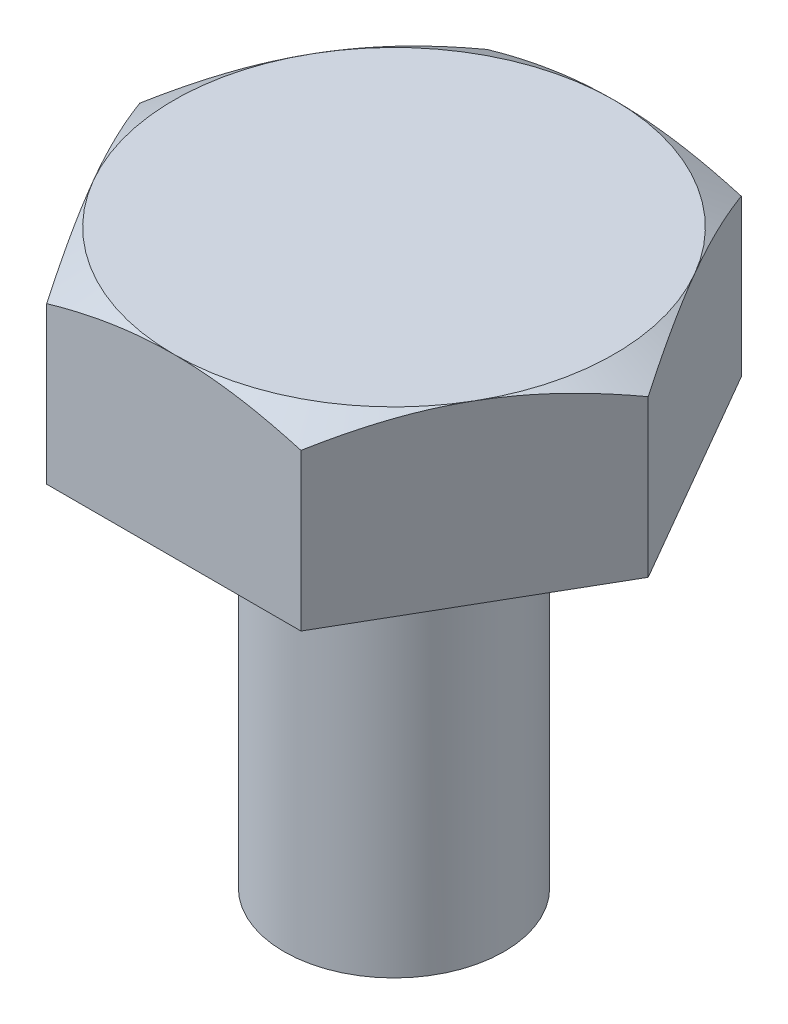
ISO-10303-21;
HEADER;
FILE_DESCRIPTION(('STEP AP214'),'2;1');
FILE_NAME('part.step','',(''),(''),'','','');
FILE_SCHEMA(('AUTOMOTIVE_DESIGN { 1 0 10303 214 1 1 1 1 }'));
ENDSEC;
DATA;
#1=APPLICATION_CONTEXT('core data for automotive mechanical design processes');
#2=APPLICATION_PROTOCOL_DEFINITION('international standard','automotive_design',2000,#1);
#3=PRODUCT_CONTEXT('',#1,'mechanical');
#4=PRODUCT('Part','Part','',(#3));
#5=PRODUCT_RELATED_PRODUCT_CATEGORY('part','',(#4));
#6=PRODUCT_DEFINITION_FORMATION('','',#4);
#7=PRODUCT_DEFINITION_CONTEXT('part definition',#1,'design');
#8=PRODUCT_DEFINITION('design','',#6,#7);
#9=PRODUCT_DEFINITION_SHAPE('','',#8);
#10=(LENGTH_UNIT() NAMED_UNIT(*) SI_UNIT(.MILLI.,.METRE.));
#11=(NAMED_UNIT(*) PLANE_ANGLE_UNIT() SI_UNIT($,.RADIAN.));
#12=(NAMED_UNIT(*) SI_UNIT($,.STERADIAN.) SOLID_ANGLE_UNIT());
#13=UNCERTAINTY_MEASURE_WITH_UNIT(LENGTH_MEASURE(1.E-05),#10,'distance_accuracy_value','');
#14=(GEOMETRIC_REPRESENTATION_CONTEXT(3) GLOBAL_UNCERTAINTY_ASSIGNED_CONTEXT((#13)) GLOBAL_UNIT_ASSIGNED_CONTEXT((#10,
#11,#12)) REPRESENTATION_CONTEXT('',''));
#15=CARTESIAN_POINT('',(0.,0.,0.));
#16=DIRECTION('',(0.,0.,1.));
#17=DIRECTION('',(1.,0.,0.));
#18=AXIS2_PLACEMENT_3D('',#15,#16,#17);
#19=CARTESIAN_POINT('',(2.88675134594818,-4.,4.99999999999995));
#20=DIRECTION('',(0.866025403784442,0.,0.499999999999995));
#21=DIRECTION('',(0.499999999999995,0.,-0.866025403784442));
#22=AXIS2_PLACEMENT_3D('',#19,#20,#21);
#23=PLANE('',#22);
#24=DIRECTION('',(0.,1.,0.));
#25=VECTOR('',#24,1.);
#26=CARTESIAN_POINT('',(5.77350269189624,-4.,0.));
#27=LINE('',#26,#25);
#28=CARTESIAN_POINT('',(5.77350269189624,-4.,0.));
#29=VERTEX_POINT('',#28);
#30=CARTESIAN_POINT('',(5.77350269189624,-0.446580567773385,0.));
#31=VERTEX_POINT('',#30);
#32=EDGE_CURVE('E141',#29,#31,#27,.T.);
#33=ORIENTED_EDGE('',*,*,#32,.T.);
#34=CARTESIAN_POINT('',(5.77361816195007,-0.446647236440011,-0.000200000000000014));
#35=CARTESIAN_POINT('',(5.64675433465069,-0.373385148025819,0.219534594525185));
#36=CARTESIAN_POINT('',(5.51880543790588,-0.306749902306278,0.441148584459581));
#37=CARTESIAN_POINT('',(5.26069210252316,-0.190437571399,0.888213995453513));
#38=CARTESIAN_POINT('',(5.1305230779472,-0.14080163030398,1.11367335959077));
#39=CARTESIAN_POINT('',(4.8717783900464,-0.0635496058068919,1.56183230522351));
#40=CARTESIAN_POINT('',(4.74324302208386,-0.0354189586716842,1.78446209310419));
#41=CARTESIAN_POINT('',(4.54998783160116,-0.010193502341881,2.11918990184664));
#42=CARTESIAN_POINT('',(4.48552534905128,-0.00461204015768112,2.23084219680506));
#43=CARTESIAN_POINT('',(4.35654081066911,0.000799202860331559,2.4542499706738));
#44=CARTESIAN_POINT('',(4.2920187567385,0.000629161353597956,2.56600544629031));
#45=CARTESIAN_POINT('',(4.11524635305245,-0.00775221218023627,2.87218423085063));
#46=CARTESIAN_POINT('',(4.00305457769147,-0.0218283522854515,3.0665060859672));
#47=CARTESIAN_POINT('',(3.77941563226459,-0.0664638374976299,3.45386010199769));
#48=CARTESIAN_POINT('',(3.6679692482842,-0.097038440535706,3.64689090137155));
#49=CARTESIAN_POINT('',(3.44387972423147,-0.173467074009359,4.03502534247482));
#50=CARTESIAN_POINT('',(3.33126486598683,-0.219644959266873,4.2300799986417));
#51=CARTESIAN_POINT('',(3.10771464157944,-0.324450374880123,4.61728034535872));
#52=CARTESIAN_POINT('',(2.99677641204851,-0.38305328382556,4.80943099540804));
#53=CARTESIAN_POINT('',(2.88663587589434,-0.446647236440012,5.00019999999995));
#54=B_SPLINE_CURVE_WITH_KNOTS('',3,(#34,#35,#36,#37,#38,#39,#40,#41,#42,#43,#44,#45,#46,#47,#48,
#49,#50,#51,#52,#53),.UNSPECIFIED.,.F.,.F.,(4,2,2,2,2,2,2,2,2,4),(0.,0.792555841363087,
1.58701660053333,2.36181537487279,2.74884076077324,3.13585419177293,3.80962362599676,
4.48401723901184,5.17336882348922,5.86136694793717),.UNSPECIFIED.);
#55=CARTESIAN_POINT('',(4.33012914833991,0.,2.50000122941986));
#56=VERTEX_POINT('',#55);
#57=EDGE_CURVE('E56',#31,#56,#54,.T.);
#58=ORIENTED_EDGE('',*,*,#57,.T.);
#59=CARTESIAN_POINT('',(2.88675134594817,-0.446580567773385,4.99999999999995));
#60=VERTEX_POINT('',#59);
#61=EDGE_CURVE('E106',#56,#60,#54,.T.);
#62=ORIENTED_EDGE('',*,*,#61,.T.);
#63=DIRECTION('',(0.,1.,0.));
#64=VECTOR('',#63,1.);
#65=CARTESIAN_POINT('',(2.88675134594818,-4.,4.99999999999995));
#66=LINE('',#65,#64);
#67=CARTESIAN_POINT('',(2.88675134594818,-4.,4.99999999999995));
#68=VERTEX_POINT('',#67);
#69=EDGE_CURVE('E115',#68,#60,#66,.T.);
#70=ORIENTED_EDGE('',*,*,#69,.F.);
#71=DIRECTION('',(0.499999999999995,0.,-0.866025403784442));
#72=VECTOR('',#71,1.);
#73=CARTESIAN_POINT('',(2.88675134594818,-4.,4.99999999999995));
#74=LINE('',#73,#72);
#75=EDGE_CURVE('E156',#68,#29,#74,.T.);
#76=ORIENTED_EDGE('',*,*,#75,.T.);
#77=EDGE_LOOP('',(#33,#58,#62,#70,#76));
#78=FACE_BOUND('',#77,.T.);
#79=ADVANCED_FACE('F33',(#78),#23,.T.);
#80=CARTESIAN_POINT('',(-2.88675134594807,-4.,5.00000000000001));
#81=DIRECTION('',(0.,0.,1.));
#82=DIRECTION('',(1.,0.,0.));
#83=AXIS2_PLACEMENT_3D('',#80,#81,#82);
#84=PLANE('',#83);
#85=ORIENTED_EDGE('',*,*,#69,.T.);
#86=CARTESIAN_POINT('',(-7.65609018435094,-2.39263220212063,5.00000000000006));
#87=CARTESIAN_POINT('',(-7.43656190937069,-2.28654401218329,5.00000000000006));
#88=CARTESIAN_POINT('',(-7.21651459555466,-2.1815104270237,5.00000000000005));
#89=CARTESIAN_POINT('',(-6.7751012500889,-1.97415510272064,5.00000000000005));
#90=CARTESIAN_POINT('',(-6.55373499813813,-1.8718338331031,5.00000000000005));
#91=CARTESIAN_POINT('',(-6.10820733372779,-1.66996674232914,5.00000000000004));
#92=CARTESIAN_POINT('',(-5.88403717501922,-1.57044015476935,5.00000000000004));
#93=CARTESIAN_POINT('',(-5.43385436348423,-1.3756618908499,5.00000000000003));
#94=CARTESIAN_POINT('',(-5.20784180742595,-1.28040999165875,5.00000000000003));
#95=CARTESIAN_POINT('',(-4.75080902593032,-1.09418696044532,5.00000000000003));
#96=CARTESIAN_POINT('',(-4.51976138696337,-1.00328273956002,5.00000000000002));
#97=CARTESIAN_POINT('',(-4.05494070596534,-0.828593945863442,5.00000000000002));
#98=CARTESIAN_POINT('',(-3.82116736399506,-0.744810165163836,5.00000000000002));
#99=CARTESIAN_POINT('',(-3.3510043325748,-0.586613265985593,5.00000000000001));
#100=CARTESIAN_POINT('',(-3.11462141422778,-0.512180225528789,5.00000000000001));
#101=CARTESIAN_POINT('',(-2.63849263778652,-0.375103017176557,5.00000000000001));
#102=CARTESIAN_POINT('',(-2.39874786903994,-0.312455121219565,5.));
#103=CARTESIAN_POINT('',(-1.91574318982232,-0.201986365962789,5.));
#104=CARTESIAN_POINT('',(-1.67248236141111,-0.154169454542874,5.));
#105=CARTESIAN_POINT('',(-1.18299374299526,-0.0765941556154826,4.99999999999999));
#106=CARTESIAN_POINT('',(-0.93676595036768,-0.0468357840738073,4.99999999999999));
#107=CARTESIAN_POINT('',(-0.567032419424467,-0.0176497910831011,4.99999999999998));
#108=CARTESIAN_POINT('',(-0.444105436588524,-0.0104949065327889,4.99999999999998));
#109=CARTESIAN_POINT('',(-0.198053141742521,-0.00139403576330962,4.99999999999998));
#110=CARTESIAN_POINT('',(-0.0749278323287925,0.000552018099978425,4.99999999999998));
#111=CARTESIAN_POINT('',(0.171257867231158,-0.000817048092456717,4.99999999999998));
#112=CARTESIAN_POINT('',(0.294318265897848,-0.00413069022137298,4.99999999999998));
#113=CARTESIAN_POINT('',(0.540192602192616,-0.0159351696708046,4.99999999999997));
#114=CARTESIAN_POINT('',(0.663006527068324,-0.0244262682762967,4.99999999999997));
#115=CARTESIAN_POINT('',(0.960681742759001,-0.0511049465513444,4.99999999999997));
#116=CARTESIAN_POINT('',(1.13531422840853,-0.0718875309514342,4.99999999999997));
#117=CARTESIAN_POINT('',(1.48321661523302,-0.122764212712431,4.99999999999996));
#118=CARTESIAN_POINT('',(1.65648633154974,-0.152859551739061,4.99999999999996));
#119=CARTESIAN_POINT('',(2.00155410564534,-0.221297339178058,4.99999999999996));
#120=CARTESIAN_POINT('',(2.17335051478505,-0.259648021310516,4.99999999999995));
#121=CARTESIAN_POINT('',(2.51518151544091,-0.343426842513885,4.99999999999995));
#122=CARTESIAN_POINT('',(2.68521621354955,-0.388854550690059,4.99999999999995));
#123=CARTESIAN_POINT('',(3.02770301117754,-0.486886309173089,4.99999999999995));
#124=CARTESIAN_POINT('',(3.20011230264631,-0.539638887650472,4.99999999999994));
#125=CARTESIAN_POINT('',(3.54310851544624,-0.650356304639038,4.99999999999994));
#126=CARTESIAN_POINT('',(3.71369660418826,-0.708317548045724,4.99999999999994));
#127=CARTESIAN_POINT('',(4.0523659032244,-0.828255048596891,4.99999999999994));
#128=CARTESIAN_POINT('',(4.2204558193518,-0.890206870222438,4.99999999999993));
#129=CARTESIAN_POINT('',(4.55533150693029,-1.01774673287997,4.99999999999993));
#130=CARTESIAN_POINT('',(4.72211671976801,-1.08333624354761,4.99999999999993));
#131=CARTESIAN_POINT('',(4.88829602037971,-1.15038475100049,4.99999999999993));
#132=B_SPLINE_CURVE_WITH_KNOTS('',3,(#86,#87,#88,#89,#90,#91,#92,#93,#94,#95,#96,#97,#98,#99,
#100,#101,#102,#103,#104,#105,#106,#107,#108,#109,#110,#111,#112,#113,#114,#115,#116,#117,#118,
#119,#120,#121,#122,#123,#124,#125,#126,#127,#128,#129,#130,#131),.UNSPECIFIED.,.F.,.F.,(4,2,2,
2,2,2,2,2,2,2,2,2,2,2,2,2,2,2,2,2,2,2,4),(0.,0.731464746840386,1.46305530058782,
2.19883245126867,2.9345712026118,3.67934254544627,4.424196632036,5.16743585966691,
5.91043957739487,6.65364090688248,7.39684289344359,7.76615422427022,8.13546075903743,
8.50466354039125,8.87388495543627,9.4011855081749,9.92855639599253,10.4564557308474,
10.984322936358,11.5251203048538,12.065547231906,12.602932273231,13.140536023766),.UNSPECIFIED.);
#133=CARTESIAN_POINT('',(0.,0.,5.00000245883977));
#134=VERTEX_POINT('',#133);
#135=EDGE_CURVE('E103',#60,#134,#132,.F.);
#136=ORIENTED_EDGE('',*,*,#135,.T.);
#137=CARTESIAN_POINT('',(-2.88675134594807,-0.446580567773385,5.00000000000001));
#138=VERTEX_POINT('',#137);
#139=EDGE_CURVE('E110',#134,#138,#132,.F.);
#140=ORIENTED_EDGE('',*,*,#139,.T.);
#141=DIRECTION('',(0.,1.,0.));
#142=VECTOR('',#141,1.);
#143=CARTESIAN_POINT('',(-2.88675134594807,-4.,5.00000000000001));
#144=LINE('',#143,#142);
#145=CARTESIAN_POINT('',(-2.88675134594807,-4.,5.00000000000001));
#146=VERTEX_POINT('',#145);
#147=EDGE_CURVE('E123',#146,#138,#144,.T.);
#148=ORIENTED_EDGE('',*,*,#147,.F.);
#149=DIRECTION('',(1.,0.,0.));
#150=VECTOR('',#149,1.);
#151=CARTESIAN_POINT('',(-2.88675134594807,-4.,5.00000000000001));
#152=LINE('',#151,#150);
#153=EDGE_CURVE('E121',#146,#68,#152,.T.);
#154=ORIENTED_EDGE('',*,*,#153,.T.);
#155=EDGE_LOOP('',(#85,#136,#140,#148,#154));
#156=FACE_BOUND('',#155,.T.);
#157=ADVANCED_FACE('F119',(#156),#84,.T.);
#158=CARTESIAN_POINT('',(-5.77350269189624,-4.,0.));
#159=DIRECTION('',(-0.866025403784435,0.,0.500000000000007));
#160=DIRECTION('',(0.500000000000007,0.,0.866025403784435));
#161=AXIS2_PLACEMENT_3D('',#158,#159,#160);
#162=PLANE('',#161);
#163=ORIENTED_EDGE('',*,*,#147,.T.);
#164=CARTESIAN_POINT('',(-2.88663587589423,-0.446647236440011,5.00020000000001));
#165=CARTESIAN_POINT('',(-3.01349970319362,-0.373385148025818,4.78046540547482));
#166=CARTESIAN_POINT('',(-3.14144859993843,-0.306749902306276,4.55885141554043));
#167=CARTESIAN_POINT('',(-3.39956193532116,-0.190437571398996,4.1117860045465));
#168=CARTESIAN_POINT('',(-3.52973095989713,-0.140801630303975,3.88632664040924));
#169=CARTESIAN_POINT('',(-3.78847564779793,-0.0635496058068847,3.43816769477651));
#170=CARTESIAN_POINT('',(-3.91701101576047,-0.0354189586716763,3.21553790689583));
#171=CARTESIAN_POINT('',(-4.11026620624318,-0.0101935023418717,2.88081009815339));
#172=CARTESIAN_POINT('',(-4.17472868879306,-0.00461204015767121,2.76915780319497));
#173=CARTESIAN_POINT('',(-4.30371322717523,0.000799202860342682,2.54575002932623));
#174=CARTESIAN_POINT('',(-4.36823528110584,0.000629161353609746,2.43399455370972));
#175=CARTESIAN_POINT('',(-4.5450076847919,-0.00775221218022298,2.12781576914939));
#176=CARTESIAN_POINT('',(-4.65719946015289,-0.021828352285438,1.93349391403282));
#177=CARTESIAN_POINT('',(-4.88083840557978,-0.0664638374976171,1.54613989800233));
#178=CARTESIAN_POINT('',(-4.99228478956017,-0.097038440535694,1.35310909862847));
#179=CARTESIAN_POINT('',(-5.21637431361292,-0.173467074009349,0.964974657525183));
#180=CARTESIAN_POINT('',(-5.32898917185756,-0.219644959266865,0.769920001358302));
#181=CARTESIAN_POINT('',(-5.55253939626496,-0.324450374880119,0.38271965464127));
#182=CARTESIAN_POINT('',(-5.66347762579589,-0.383053283825558,0.190569004591953));
#183=CARTESIAN_POINT('',(-5.77361816195007,-0.446647236440012,-0.000199999999959464));
#184=B_SPLINE_CURVE_WITH_KNOTS('',3,(#164,#165,#166,#167,#168,#169,#170,#171,#172,#173,#174,
#175,#176,#177,#178,#179,#180,#181,#182,#183),.UNSPECIFIED.,.F.,.F.,(4,2,2,2,2,2,2,2,2,4),(0.,
0.792555841363088,1.58701660053333,2.36181537487279,2.74884076077324,3.13585419177293,
3.80962362599678,4.48401723901188,5.17336882348927,5.86136694793724),.UNSPECIFIED.);
#185=CARTESIAN_POINT('',(-4.33012914833987,0.,2.50000122941992));
#186=VERTEX_POINT('',#185);
#187=EDGE_CURVE('E207',#138,#186,#184,.T.);
#188=ORIENTED_EDGE('',*,*,#187,.T.);
#189=CARTESIAN_POINT('',(-5.77350269189624,-0.446580567773385,0.));
#190=VERTEX_POINT('',#189);
#191=EDGE_CURVE('E201',#186,#190,#184,.T.);
#192=ORIENTED_EDGE('',*,*,#191,.T.);
#193=DIRECTION('',(0.,1.,0.));
#194=VECTOR('',#193,1.);
#195=CARTESIAN_POINT('',(-5.77350269189624,-4.,0.));
#196=LINE('',#195,#194);
#197=CARTESIAN_POINT('',(-5.77350269189624,-4.,0.));
#198=VERTEX_POINT('',#197);
#199=EDGE_CURVE('E128',#198,#190,#196,.T.);
#200=ORIENTED_EDGE('',*,*,#199,.F.);
#201=DIRECTION('',(0.500000000000007,0.,0.866025403784435));
#202=VECTOR('',#201,1.);
#203=CARTESIAN_POINT('',(-5.77350269189624,-4.,0.));
#204=LINE('',#203,#202);
#205=EDGE_CURVE('E142',#198,#146,#204,.T.);
#206=ORIENTED_EDGE('',*,*,#205,.T.);
#207=EDGE_LOOP('',(#163,#188,#192,#200,#206));
#208=FACE_BOUND('',#207,.T.);
#209=ADVANCED_FACE('F209',(#208),#162,.T.);
#210=CARTESIAN_POINT('',(-2.88675134594814,-4.,-4.99999999999997));
#211=DIRECTION('',(-0.866025403784442,0.,-0.499999999999995));
#212=DIRECTION('',(-0.499999999999995,0.,0.866025403784442));
#213=AXIS2_PLACEMENT_3D('',#210,#211,#212);
#214=PLANE('',#213);
#215=ORIENTED_EDGE('',*,*,#199,.T.);
#216=CARTESIAN_POINT('',(-5.77361816195007,-0.446647236440012,0.000200000000040302));
#217=CARTESIAN_POINT('',(-5.64675433465069,-0.373385148025819,-0.219534594525144));
#218=CARTESIAN_POINT('',(-5.51880543790588,-0.306749902306277,-0.441148584459539));
#219=CARTESIAN_POINT('',(-5.26069210252317,-0.190437571398997,-0.888213995453472));
#220=CARTESIAN_POINT('',(-5.1305230779472,-0.140801630303975,-1.11367335959073));
#221=CARTESIAN_POINT('',(-4.8717783900464,-0.0635496058068852,-1.56183230522347));
#222=CARTESIAN_POINT('',(-4.74324302208386,-0.0354189586716767,-1.78446209310415));
#223=CARTESIAN_POINT('',(-4.54998783160116,-0.0101935023418716,-2.1191899018466));
#224=CARTESIAN_POINT('',(-4.48552534905128,-0.00461204015767096,-2.23084219680502));
#225=CARTESIAN_POINT('',(-4.35654081066911,0.000799202860342928,-2.45424997067375));
#226=CARTESIAN_POINT('',(-4.2920187567385,0.000629161353609771,-2.56600544629027));
#227=CARTESIAN_POINT('',(-4.11524635305245,-0.00775221218022334,-2.8721842308506));
#228=CARTESIAN_POINT('',(-4.00305457769146,-0.0218283522854384,-3.06650608596717));
#229=CARTESIAN_POINT('',(-3.77941563226458,-0.0664638374976171,-3.45386010199767));
#230=CARTESIAN_POINT('',(-3.66796924828419,-0.0970384405356937,-3.64689090137153));
#231=CARTESIAN_POINT('',(-3.44387972423145,-0.173467074009348,-4.03502534247482));
#232=CARTESIAN_POINT('',(-3.33126486598681,-0.219644959266865,-4.2300799986417));
#233=CARTESIAN_POINT('',(-3.10771464157942,-0.324450374880118,-4.61728034535873));
#234=CARTESIAN_POINT('',(-2.99677641204848,-0.383053283825558,-4.80943099540805));
#235=CARTESIAN_POINT('',(-2.8866358758943,-0.446647236440012,-5.00019999999997));
#236=B_SPLINE_CURVE_WITH_KNOTS('',3,(#216,#217,#218,#219,#220,#221,#222,#223,#224,#225,#226,
#227,#228,#229,#230,#231,#232,#233,#234,#235),.UNSPECIFIED.,.F.,.F.,(4,2,2,2,2,2,2,2,2,4),(0.,
0.792555841363087,1.58701660053333,2.36181537487279,2.74884076077324,3.13585419177293,
3.80962362599678,4.48401723901188,5.17336882348927,5.86136694793724),.UNSPECIFIED.);
#237=CARTESIAN_POINT('',(-4.33012914833991,0.,-2.50000122941986));
#238=VERTEX_POINT('',#237);
#239=EDGE_CURVE('E208',#190,#238,#236,.T.);
#240=ORIENTED_EDGE('',*,*,#239,.T.);
#241=CARTESIAN_POINT('',(-2.88675134594814,-0.446580567773385,-4.99999999999997));
#242=VERTEX_POINT('',#241);
#243=EDGE_CURVE('E196',#238,#242,#236,.T.);
#244=ORIENTED_EDGE('',*,*,#243,.T.);
#245=DIRECTION('',(0.,1.,0.));
#246=VECTOR('',#245,1.);
#247=CARTESIAN_POINT('',(-2.88675134594814,-4.,-4.99999999999997));
#248=LINE('',#247,#246);
#249=CARTESIAN_POINT('',(-2.88675134594814,-4.,-4.99999999999997));
#250=VERTEX_POINT('',#249);
#251=EDGE_CURVE('E135',#250,#242,#248,.T.);
#252=ORIENTED_EDGE('',*,*,#251,.F.);
#253=DIRECTION('',(-0.499999999999995,0.,0.866025403784442));
#254=VECTOR('',#253,1.);
#255=CARTESIAN_POINT('',(-2.88675134594814,-4.,-4.99999999999997));
#256=LINE('',#255,#254);
#257=EDGE_CURVE('E144',#250,#198,#256,.T.);
#258=ORIENTED_EDGE('',*,*,#257,.T.);
#259=EDGE_LOOP('',(#215,#240,#244,#252,#258));
#260=FACE_BOUND('',#259,.T.);
#261=ADVANCED_FACE('F212',(#260),#214,.T.);
#262=CARTESIAN_POINT('',(2.88675134594811,-4.,-4.99999999999999));
#263=DIRECTION('',(0.,0.,-1.));
#264=DIRECTION('',(-1.,0.,0.));
#265=AXIS2_PLACEMENT_3D('',#262,#263,#264);
#266=PLANE('',#265);
#267=ORIENTED_EDGE('',*,*,#251,.T.);
#268=CARTESIAN_POINT('',(-7.65609018435101,-2.39263220212063,-4.99999999999995));
#269=CARTESIAN_POINT('',(-7.43656190937076,-2.28654401218329,-4.99999999999995));
#270=CARTESIAN_POINT('',(-7.21651459555473,-2.1815104270237,-4.99999999999995));
#271=CARTESIAN_POINT('',(-6.77510125008897,-1.97415510272064,-4.99999999999995));
#272=CARTESIAN_POINT('',(-6.5537349981382,-1.8718338331031,-4.99999999999995));
#273=CARTESIAN_POINT('',(-6.10820733372786,-1.66996674232914,-4.99999999999996));
#274=CARTESIAN_POINT('',(-5.88403717501929,-1.57044015476935,-4.99999999999996));
#275=CARTESIAN_POINT('',(-5.4338543634843,-1.3756618908499,-4.99999999999996));
#276=CARTESIAN_POINT('',(-5.20784180742602,-1.28040999165875,-4.99999999999996));
#277=CARTESIAN_POINT('',(-4.75080902593039,-1.09418696044532,-4.99999999999996));
#278=CARTESIAN_POINT('',(-4.51976138696344,-1.00328273956002,-4.99999999999996));
#279=CARTESIAN_POINT('',(-4.05494070596541,-0.828593945863441,-4.99999999999996));
#280=CARTESIAN_POINT('',(-3.82116736399513,-0.744810165163836,-4.99999999999996));
#281=CARTESIAN_POINT('',(-3.35100433257487,-0.586613265985593,-4.99999999999997));
#282=CARTESIAN_POINT('',(-3.11462141422784,-0.512180225528788,-4.99999999999997));
#283=CARTESIAN_POINT('',(-2.63849263778659,-0.375103017176557,-4.99999999999997));
#284=CARTESIAN_POINT('',(-2.39874786904001,-0.312455121219565,-4.99999999999997));
#285=CARTESIAN_POINT('',(-1.91574318982239,-0.201986365962789,-4.99999999999997));
#286=CARTESIAN_POINT('',(-1.67248236141118,-0.154169454542874,-4.99999999999997));
#287=CARTESIAN_POINT('',(-1.18299374299533,-0.0765941556154829,-4.99999999999997));
#288=CARTESIAN_POINT('',(-0.936765950367749,-0.0468357840738076,-4.99999999999998));
#289=CARTESIAN_POINT('',(-0.567032419424536,-0.0176497910831013,-4.99999999999998));
#290=CARTESIAN_POINT('',(-0.444105436588593,-0.010494906532789,-4.99999999999998));
#291=CARTESIAN_POINT('',(-0.198053141742591,-0.0013940357633099,-4.99999999999998));
#292=CARTESIAN_POINT('',(-0.0749278323288623,0.000552018099977847,-4.99999999999998));
#293=CARTESIAN_POINT('',(0.171257867231089,-0.000817048092457423,-4.99999999999998));
#294=CARTESIAN_POINT('',(0.294318265897779,-0.00413069022137357,-4.99999999999998));
#295=CARTESIAN_POINT('',(0.540192602192547,-0.0159351696708052,-4.99999999999998));
#296=CARTESIAN_POINT('',(0.663006527068255,-0.0244262682762974,-4.99999999999998));
#297=CARTESIAN_POINT('',(0.960681742758932,-0.051104946551345,-4.99999999999998));
#298=CARTESIAN_POINT('',(1.13531422840846,-0.0718875309514346,-4.99999999999998));
#299=CARTESIAN_POINT('',(1.48321661523295,-0.122764212712431,-4.99999999999998));
#300=CARTESIAN_POINT('',(1.65648633154967,-0.152859551739061,-4.99999999999998));
#301=CARTESIAN_POINT('',(2.00155410564528,-0.221297339178058,-4.99999999999999));
#302=CARTESIAN_POINT('',(2.17335051478498,-0.259648021310517,-4.99999999999999));
#303=CARTESIAN_POINT('',(2.51518151544084,-0.343426842513885,-4.99999999999999));
#304=CARTESIAN_POINT('',(2.68521621354948,-0.388854550690059,-4.99999999999999));
#305=CARTESIAN_POINT('',(3.02770301117747,-0.48688630917309,-4.99999999999999));
#306=CARTESIAN_POINT('',(3.20011230264624,-0.539638887650472,-4.99999999999999));
#307=CARTESIAN_POINT('',(3.54310851544617,-0.650356304639038,-4.99999999999999));
#308=CARTESIAN_POINT('',(3.71369660418819,-0.708317548045724,-4.99999999999999));
#309=CARTESIAN_POINT('',(4.05236590322432,-0.828255048596891,-4.99999999999999));
#310=CARTESIAN_POINT('',(4.22045581935173,-0.890206870222438,-4.99999999999999));
#311=CARTESIAN_POINT('',(4.55533150693022,-1.01774673287997,-4.99999999999999));
#312=CARTESIAN_POINT('',(4.72211671976793,-1.08333624354761,-4.99999999999999));
#313=CARTESIAN_POINT('',(4.88829602037964,-1.15038475100049,-5.));
#314=B_SPLINE_CURVE_WITH_KNOTS('',3,(#268,#269,#270,#271,#272,#273,#274,#275,#276,#277,#278,
#279,#280,#281,#282,#283,#284,#285,#286,#287,#288,#289,#290,#291,#292,#293,#294,#295,#296,#297,
#298,#299,#300,#301,#302,#303,#304,#305,#306,#307,#308,#309,#310,#311,#312,#313),.UNSPECIFIED.,
.F.,.F.,(4,2,2,2,2,2,2,2,2,2,2,2,2,2,2,2,2,2,2,2,2,2,4),(0.,0.731464746840386,1.46305530058782,
2.19883245126867,2.9345712026118,3.67934254544627,4.424196632036,5.16743585966691,
5.91043957739487,6.65364090688248,7.39684289344359,7.76615422427022,8.13546075903742,
8.50466354039125,8.87388495543627,9.4011855081749,9.92855639599253,10.4564557308474,
10.984322936358,11.5251203048538,12.065547231906,12.602932273231,13.140536023766),.UNSPECIFIED.);
#315=CARTESIAN_POINT('',(0.,0.,-5.00000245883977));
#316=VERTEX_POINT('',#315);
#317=EDGE_CURVE('E342',#242,#316,#314,.T.);
#318=ORIENTED_EDGE('',*,*,#317,.T.);
#319=CARTESIAN_POINT('',(2.88675134594811,-0.446580567773385,-4.99999999999999));
#320=VERTEX_POINT('',#319);
#321=EDGE_CURVE('E189',#316,#320,#314,.T.);
#322=ORIENTED_EDGE('',*,*,#321,.T.);
#323=DIRECTION('',(0.,1.,0.));
#324=VECTOR('',#323,1.);
#325=CARTESIAN_POINT('',(2.88675134594811,-4.,-4.99999999999999));
#326=LINE('',#325,#324);
#327=CARTESIAN_POINT('',(2.88675134594811,-4.,-4.99999999999999));
#328=VERTEX_POINT('',#327);
#329=EDGE_CURVE('E138',#328,#320,#326,.T.);
#330=ORIENTED_EDGE('',*,*,#329,.F.);
#331=DIRECTION('',(-1.,0.,0.));
#332=VECTOR('',#331,1.);
#333=CARTESIAN_POINT('',(2.88675134594811,-4.,-4.99999999999999));
#334=LINE('',#333,#332);
#335=EDGE_CURVE('E148',#328,#250,#334,.T.);
#336=ORIENTED_EDGE('',*,*,#335,.T.);
#337=EDGE_LOOP('',(#267,#318,#322,#330,#336));
#338=FACE_BOUND('',#337,.T.);
#339=ADVANCED_FACE('F216',(#338),#266,.T.);
#340=CARTESIAN_POINT('',(5.77350269189624,-4.,0.));
#341=DIRECTION('',(0.866025403784438,0.,-0.500000000000001));
#342=DIRECTION('',(-0.500000000000001,0.,-0.866025403784438));
#343=AXIS2_PLACEMENT_3D('',#340,#341,#342);
#344=PLANE('',#343);
#345=ORIENTED_EDGE('',*,*,#329,.T.);
#346=CARTESIAN_POINT('',(2.88663587589427,-0.446647236440012,-5.00019999999999));
#347=CARTESIAN_POINT('',(3.01349970319366,-0.373385148025819,-4.78046540547481));
#348=CARTESIAN_POINT('',(3.14144859993847,-0.306749902306277,-4.55885141554041));
#349=CARTESIAN_POINT('',(3.39956193532118,-0.190437571398997,-4.11178600454648));
#350=CARTESIAN_POINT('',(3.52973095989715,-0.140801630303975,-3.88632664040922));
#351=CARTESIAN_POINT('',(3.78847564779795,-0.0635496058068852,-3.43816769477649));
#352=CARTESIAN_POINT('',(3.91701101576049,-0.0354189586716768,-3.21553790689581));
#353=CARTESIAN_POINT('',(4.1102662062432,-0.0101935023418719,-2.88081009815336));
#354=CARTESIAN_POINT('',(4.17472868879308,-0.00461204015767133,-2.76915780319494));
#355=CARTESIAN_POINT('',(4.30371322717525,0.000799202860342548,-2.5457500293262));
#356=CARTESIAN_POINT('',(4.36823528110586,0.000629161353609465,-2.43399455370969));
#357=CARTESIAN_POINT('',(4.54500768479192,-0.00775221218022351,-2.12781576914936));
#358=CARTESIAN_POINT('',(4.6571994601529,-0.0218283522854386,-1.93349391403279));
#359=CARTESIAN_POINT('',(4.88083840557979,-0.0664638374976173,-1.5461398980023));
#360=CARTESIAN_POINT('',(4.99228478956018,-0.097038440535694,-1.35310909862843));
#361=CARTESIAN_POINT('',(5.21637431361293,-0.173467074009349,-0.964974657525146));
#362=CARTESIAN_POINT('',(5.32898917185756,-0.219644959266865,-0.769920001358265));
#363=CARTESIAN_POINT('',(5.55253939626496,-0.324450374880119,-0.382719654641232));
#364=CARTESIAN_POINT('',(5.6634776257959,-0.383053283825558,-0.190569004591913));
#365=CARTESIAN_POINT('',(5.77361816195007,-0.446647236440012,0.00020000000000003));
#366=B_SPLINE_CURVE_WITH_KNOTS('',3,(#346,#347,#348,#349,#350,#351,#352,#353,#354,#355,#356,
#357,#358,#359,#360,#361,#362,#363,#364,#365),.UNSPECIFIED.,.F.,.F.,(4,2,2,2,2,2,2,2,2,4),(0.,
0.792555841363087,1.58701660053333,2.36181537487279,2.74884076077324,3.13585419177293,
3.80962362599678,4.48401723901188,5.17336882348927,5.86136694793724),.UNSPECIFIED.);
#367=CARTESIAN_POINT('',(4.33012914833989,0.,-2.50000122941989));
#368=VERTEX_POINT('',#367);
#369=EDGE_CURVE('E339',#320,#368,#366,.T.);
#370=ORIENTED_EDGE('',*,*,#369,.T.);
#371=EDGE_CURVE('E181',#368,#31,#366,.T.);
#372=ORIENTED_EDGE('',*,*,#371,.T.);
#373=ORIENTED_EDGE('',*,*,#32,.F.);
#374=DIRECTION('',(-0.500000000000001,0.,-0.866025403784438));
#375=VECTOR('',#374,1.);
#376=CARTESIAN_POINT('',(5.77350269189624,-4.,0.));
#377=LINE('',#376,#375);
#378=EDGE_CURVE('E153',#29,#328,#377,.T.);
#379=ORIENTED_EDGE('',*,*,#378,.T.);
#380=EDGE_LOOP('',(#345,#370,#372,#373,#379));
#381=FACE_BOUND('',#380,.T.);
#382=ADVANCED_FACE('F220',(#381),#344,.T.);
#383=CARTESIAN_POINT('',(0.,-4.,0.));
#384=DIRECTION('',(0.,1.,0.));
#385=DIRECTION('',(0.,0.,1.));
#386=AXIS2_PLACEMENT_3D('',#383,#384,#385);
#387=PLANE('',#386);
#388=CARTESIAN_POINT('',(0.,-4.,0.));
#389=DIRECTION('',(0.,1.,0.));
#390=DIRECTION('',(0.,0.,1.));
#391=AXIS2_PLACEMENT_3D('',#388,#389,#390);
#392=CIRCLE('',#391,2.5);
#393=CARTESIAN_POINT('',(0.,-4.,2.5));
#394=VERTEX_POINT('',#393);
#395=EDGE_CURVE('E11',#394,#394,#392,.F.);
#396=ORIENTED_EDGE('',*,*,#395,.F.);
#397=EDGE_LOOP('',(#396));
#398=FACE_BOUND('',#397,.T.);
#399=ORIENTED_EDGE('',*,*,#75,.F.);
#400=ORIENTED_EDGE('',*,*,#153,.F.);
#401=ORIENTED_EDGE('',*,*,#205,.F.);
#402=ORIENTED_EDGE('',*,*,#257,.F.);
#403=ORIENTED_EDGE('',*,*,#335,.F.);
#404=ORIENTED_EDGE('',*,*,#378,.F.);
#405=EDGE_LOOP('',(#399,#400,#401,#402,#403,#404));
#406=FACE_BOUND('',#405,.T.);
#407=ADVANCED_FACE('F176',(#398,#406),#387,.F.);
#408=CARTESIAN_POINT('',(0.,0.,0.));
#409=DIRECTION('',(0.,-1.,0.));
#410=DIRECTION('',(0.,0.,-1.));
#411=AXIS2_PLACEMENT_3D('',#408,#409,#410);
#412=CONICAL_SURFACE('',#411,5.00000245883977,1.0471975511966);
#413=CARTESIAN_POINT('',(0.,0.,0.));
#414=DIRECTION('',(0.,1.,0.));
#415=DIRECTION('',(0.,0.,1.));
#416=AXIS2_PLACEMENT_3D('',#413,#414,#415);
#417=CIRCLE('',#416,5.00000245883977);
#418=EDGE_CURVE('E122',#186,#134,#417,.T.);
#419=ORIENTED_EDGE('',*,*,#418,.F.);
#420=ORIENTED_EDGE('',*,*,#187,.F.);
#421=ORIENTED_EDGE('',*,*,#139,.F.);
#422=EDGE_LOOP('',(#419,#420,#421));
#423=FACE_BOUND('',#422,.T.);
#424=ADVANCED_FACE('F228',(#423),#412,.T.);
#425=EDGE_CURVE('E126',#238,#186,#417,.T.);
#426=ORIENTED_EDGE('',*,*,#425,.F.);
#427=ORIENTED_EDGE('',*,*,#239,.F.);
#428=ORIENTED_EDGE('',*,*,#191,.F.);
#429=EDGE_LOOP('',(#426,#427,#428));
#430=FACE_BOUND('',#429,.T.);
#431=ADVANCED_FACE('F262',(#430),#412,.T.);
#432=EDGE_CURVE('E353',#316,#238,#417,.T.);
#433=ORIENTED_EDGE('',*,*,#432,.F.);
#434=ORIENTED_EDGE('',*,*,#317,.F.);
#435=ORIENTED_EDGE('',*,*,#243,.F.);
#436=EDGE_LOOP('',(#433,#434,#435));
#437=FACE_BOUND('',#436,.T.);
#438=ADVANCED_FACE('F172',(#437),#412,.T.);
#439=EDGE_CURVE('E354',#368,#316,#417,.T.);
#440=ORIENTED_EDGE('',*,*,#439,.F.);
#441=ORIENTED_EDGE('',*,*,#369,.F.);
#442=ORIENTED_EDGE('',*,*,#321,.F.);
#443=EDGE_LOOP('',(#440,#441,#442));
#444=FACE_BOUND('',#443,.T.);
#445=ADVANCED_FACE('F166',(#444),#412,.T.);
#446=ORIENTED_EDGE('',*,*,#371,.F.);
#447=EDGE_CURVE('E41',#56,#368,#417,.T.);
#448=ORIENTED_EDGE('',*,*,#447,.F.);
#449=ORIENTED_EDGE('',*,*,#57,.F.);
#450=EDGE_LOOP('',(#446,#448,#449));
#451=FACE_BOUND('',#450,.T.);
#452=ADVANCED_FACE('F171',(#451),#412,.T.);
#453=CARTESIAN_POINT('',(0.,0.,0.));
#454=DIRECTION('',(0.,1.,0.));
#455=DIRECTION('',(0.,0.,1.));
#456=AXIS2_PLACEMENT_3D('',#453,#454,#455);
#457=CIRCLE('',#456,5.00000245883977);
#458=EDGE_CURVE('E48',#134,#56,#457,.T.);
#459=ORIENTED_EDGE('',*,*,#458,.F.);
#460=ORIENTED_EDGE('',*,*,#135,.F.);
#461=ORIENTED_EDGE('',*,*,#61,.F.);
#462=EDGE_LOOP('',(#459,#460,#461));
#463=FACE_BOUND('',#462,.T.);
#464=ADVANCED_FACE('F105',(#463),#412,.T.);
#465=CARTESIAN_POINT('',(0.,0.,0.));
#466=DIRECTION('',(0.,1.,0.));
#467=DIRECTION('',(0.,0.,1.));
#468=AXIS2_PLACEMENT_3D('',#465,#466,#467);
#469=PLANE('',#468);
#470=ORIENTED_EDGE('',*,*,#418,.T.);
#471=ORIENTED_EDGE('',*,*,#458,.T.);
#472=ORIENTED_EDGE('',*,*,#447,.T.);
#473=ORIENTED_EDGE('',*,*,#439,.T.);
#474=ORIENTED_EDGE('',*,*,#432,.T.);
#475=ORIENTED_EDGE('',*,*,#425,.T.);
#476=EDGE_LOOP('',(#470,#471,#472,#473,#474,#475));
#477=FACE_BOUND('',#476,.T.);
#478=ADVANCED_FACE('F301',(#477),#469,.T.);
#479=CARTESIAN_POINT('',(0.,-13.,0.));
#480=DIRECTION('',(0.,1.,0.));
#481=DIRECTION('',(0.,0.,1.));
#482=AXIS2_PLACEMENT_3D('',#479,#480,#481);
#483=CYLINDRICAL_SURFACE('',#482,2.5);
#484=CARTESIAN_POINT('',(0.,-13.,0.));
#485=DIRECTION('',(0.,-1.,0.));
#486=DIRECTION('',(0.,0.,-1.));
#487=AXIS2_PLACEMENT_3D('',#484,#485,#486);
#488=CIRCLE('',#487,2.5);
#489=CARTESIAN_POINT('',(0.,-13.,-2.5));
#490=VERTEX_POINT('',#489);
#491=EDGE_CURVE('E336',#490,#490,#488,.T.);
#492=ORIENTED_EDGE('',*,*,#491,.F.);
#493=EDGE_LOOP('',(#492));
#494=FACE_BOUND('',#493,.T.);
#495=ORIENTED_EDGE('',*,*,#395,.T.);
#496=EDGE_LOOP('',(#495));
#497=FACE_BOUND('',#496,.T.);
#498=ADVANCED_FACE('F174',(#494,#497),#483,.T.);
#499=CARTESIAN_POINT('',(0.,-13.,0.));
#500=DIRECTION('',(0.,-1.,0.));
#501=DIRECTION('',(0.,0.,-1.));
#502=AXIS2_PLACEMENT_3D('',#499,#500,#501);
#503=PLANE('',#502);
#504=ORIENTED_EDGE('',*,*,#491,.T.);
#505=EDGE_LOOP('',(#504));
#506=FACE_BOUND('',#505,.T.);
#507=ADVANCED_FACE('F322',(#506),#503,.T.);
#508=CLOSED_SHELL('',(#79,#157,#209,#261,#339,#382,#407,#424,#431,#438,#445,#452,#464,#478,#498,#507));
#509=MANIFOLD_SOLID_BREP('B2',#508);
#510=ADVANCED_BREP_SHAPE_REPRESENTATION('',(#18,#509),#14);
#511=SHAPE_DEFINITION_REPRESENTATION(#9,#510);
ENDSEC;
END-ISO-10303-21;
